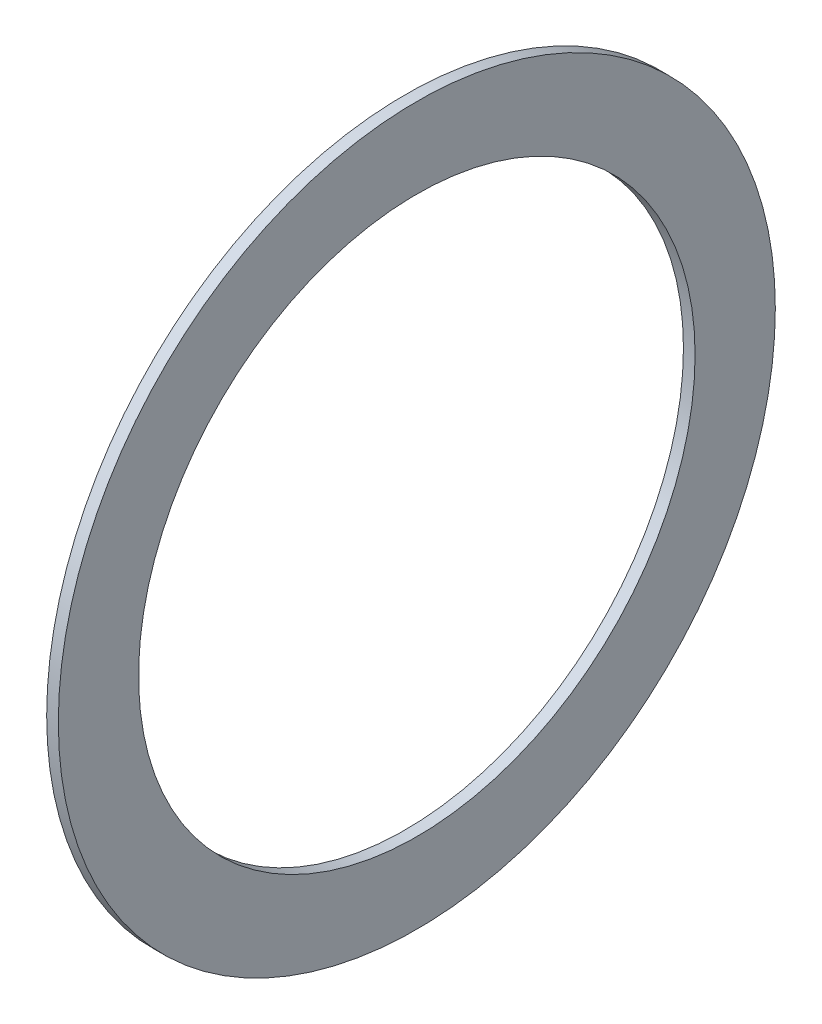
ISO-10303-21;
HEADER;
FILE_DESCRIPTION(('STEP AP214'),'2;1');
FILE_NAME('part.step','',(''),(''),'','','');
FILE_SCHEMA(('AUTOMOTIVE_DESIGN { 1 0 10303 214 1 1 1 1 }'));
ENDSEC;
DATA;
#1=APPLICATION_CONTEXT('core data for automotive mechanical design processes');
#2=APPLICATION_PROTOCOL_DEFINITION('international standard','automotive_design',2000,#1);
#3=PRODUCT_CONTEXT('',#1,'mechanical');
#4=PRODUCT('Part','Part','',(#3));
#5=PRODUCT_RELATED_PRODUCT_CATEGORY('part','',(#4));
#6=PRODUCT_DEFINITION_FORMATION('','',#4);
#7=PRODUCT_DEFINITION_CONTEXT('part definition',#1,'design');
#8=PRODUCT_DEFINITION('design','',#6,#7);
#9=PRODUCT_DEFINITION_SHAPE('','',#8);
#10=(LENGTH_UNIT() NAMED_UNIT(*) SI_UNIT(.MILLI.,.METRE.));
#11=(NAMED_UNIT(*) PLANE_ANGLE_UNIT() SI_UNIT($,.RADIAN.));
#12=(NAMED_UNIT(*) SI_UNIT($,.STERADIAN.) SOLID_ANGLE_UNIT());
#13=UNCERTAINTY_MEASURE_WITH_UNIT(LENGTH_MEASURE(1.E-05),#10,'distance_accuracy_value','');
#14=(GEOMETRIC_REPRESENTATION_CONTEXT(3) GLOBAL_UNCERTAINTY_ASSIGNED_CONTEXT((#13)) GLOBAL_UNIT_ASSIGNED_CONTEXT((#10,
#11,#12)) REPRESENTATION_CONTEXT('',''));
#15=CARTESIAN_POINT('',(0.,0.,0.));
#16=DIRECTION('',(0.,0.,1.));
#17=DIRECTION('',(1.,0.,0.));
#18=AXIS2_PLACEMENT_3D('',#15,#16,#17);
#19=CARTESIAN_POINT('',(13.8,27.7,0.));
#20=DIRECTION('',(-1.,0.,0.));
#21=DIRECTION('',(0.,0.,1.));
#22=AXIS2_PLACEMENT_3D('',#19,#20,#21);
#23=PLANE('',#22);
#24=CARTESIAN_POINT('',(13.8,0.,0.));
#25=DIRECTION('',(1.,0.,0.));
#26=DIRECTION('',(0.,0.,-1.));
#27=AXIS2_PLACEMENT_3D('',#24,#25,#26);
#28=CIRCLE('',#27,21.5);
#29=CARTESIAN_POINT('',(13.8,0.,-21.5));
#30=VERTEX_POINT('',#29);
#31=EDGE_CURVE('E30',#30,#30,#28,.T.);
#32=ORIENTED_EDGE('',*,*,#31,.T.);
#33=EDGE_LOOP('',(#32));
#34=FACE_BOUND('',#33,.T.);
#35=CARTESIAN_POINT('',(13.8,0.,0.));
#36=DIRECTION('',(1.,0.,0.));
#37=DIRECTION('',(0.,0.,-1.));
#38=AXIS2_PLACEMENT_3D('',#35,#36,#37);
#39=CIRCLE('',#38,27.7);
#40=CARTESIAN_POINT('',(13.8,0.,-27.7));
#41=VERTEX_POINT('',#40);
#42=EDGE_CURVE('E26',#41,#41,#39,.T.);
#43=ORIENTED_EDGE('',*,*,#42,.F.);
#44=EDGE_LOOP('',(#43));
#45=FACE_BOUND('',#44,.T.);
#46=ADVANCED_FACE('F15',(#34,#45),#23,.T.);
#47=CARTESIAN_POINT('',(14.7,0.,0.));
#48=DIRECTION('',(1.,0.,0.));
#49=DIRECTION('',(0.,0.,-1.));
#50=AXIS2_PLACEMENT_3D('',#47,#48,#49);
#51=CYLINDRICAL_SURFACE('',#50,21.5);
#52=CARTESIAN_POINT('',(14.7,0.,0.));
#53=DIRECTION('',(1.,0.,0.));
#54=DIRECTION('',(0.,0.,-1.));
#55=AXIS2_PLACEMENT_3D('',#52,#53,#54);
#56=CIRCLE('',#55,21.5);
#57=CARTESIAN_POINT('',(14.7,0.,-21.5));
#58=VERTEX_POINT('',#57);
#59=EDGE_CURVE('E22',#58,#58,#56,.T.);
#60=ORIENTED_EDGE('',*,*,#59,.T.);
#61=EDGE_LOOP('',(#60));
#62=FACE_BOUND('',#61,.T.);
#63=ORIENTED_EDGE('',*,*,#31,.F.);
#64=EDGE_LOOP('',(#63));
#65=FACE_BOUND('',#64,.T.);
#66=ADVANCED_FACE('F38',(#62,#65),#51,.F.);
#67=CARTESIAN_POINT('',(14.7,0.,0.));
#68=DIRECTION('',(1.,0.,0.));
#69=DIRECTION('',(0.,0.,-1.));
#70=AXIS2_PLACEMENT_3D('',#67,#68,#69);
#71=CYLINDRICAL_SURFACE('',#70,27.7);
#72=ORIENTED_EDGE('',*,*,#42,.T.);
#73=EDGE_LOOP('',(#72));
#74=FACE_BOUND('',#73,.T.);
#75=CARTESIAN_POINT('',(14.7,0.,0.));
#76=DIRECTION('',(1.,0.,0.));
#77=DIRECTION('',(0.,0.,-1.));
#78=AXIS2_PLACEMENT_3D('',#75,#76,#77);
#79=CIRCLE('',#78,27.7);
#80=CARTESIAN_POINT('',(14.7,0.,-27.7));
#81=VERTEX_POINT('',#80);
#82=EDGE_CURVE('E10',#81,#81,#79,.T.);
#83=ORIENTED_EDGE('',*,*,#82,.F.);
#84=EDGE_LOOP('',(#83));
#85=FACE_BOUND('',#84,.T.);
#86=ADVANCED_FACE('F40',(#74,#85),#71,.T.);
#87=CARTESIAN_POINT('',(14.7,21.5,0.));
#88=DIRECTION('',(1.,0.,0.));
#89=DIRECTION('',(0.,0.,-1.));
#90=AXIS2_PLACEMENT_3D('',#87,#88,#89);
#91=PLANE('',#90);
#92=ORIENTED_EDGE('',*,*,#82,.T.);
#93=EDGE_LOOP('',(#92));
#94=FACE_BOUND('',#93,.T.);
#95=ORIENTED_EDGE('',*,*,#59,.F.);
#96=EDGE_LOOP('',(#95));
#97=FACE_BOUND('',#96,.T.);
#98=ADVANCED_FACE('F17',(#94,#97),#91,.T.);
#99=CLOSED_SHELL('',(#46,#66,#86,#98));
#100=MANIFOLD_SOLID_BREP('B1',#99);
#101=ADVANCED_BREP_SHAPE_REPRESENTATION('',(#18,#100),#14);
#102=SHAPE_DEFINITION_REPRESENTATION(#9,#101);
ENDSEC;
END-ISO-10303-21;
